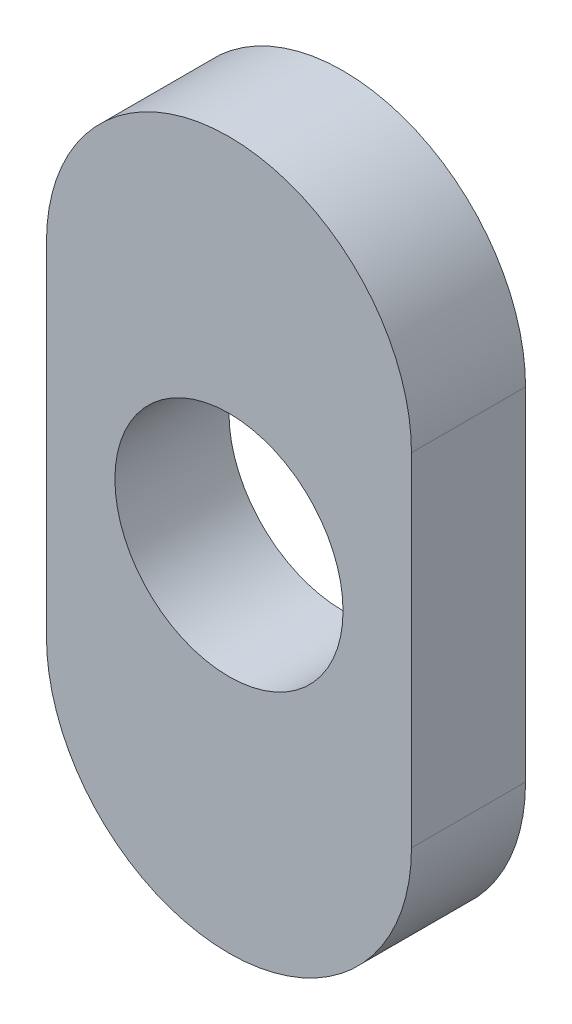
ISO-10303-21;
HEADER;
FILE_DESCRIPTION(('STEP AP214'),'2;1');
FILE_NAME('part.step','',(''),(''),'','','');
FILE_SCHEMA(('AUTOMOTIVE_DESIGN { 1 0 10303 214 1 1 1 1 }'));
ENDSEC;
DATA;
#1=APPLICATION_CONTEXT('core data for automotive mechanical design processes');
#2=APPLICATION_PROTOCOL_DEFINITION('international standard','automotive_design',2000,#1);
#3=PRODUCT_CONTEXT('',#1,'mechanical');
#4=PRODUCT('Part','Part','',(#3));
#5=PRODUCT_RELATED_PRODUCT_CATEGORY('part','',(#4));
#6=PRODUCT_DEFINITION_FORMATION('','',#4);
#7=PRODUCT_DEFINITION_CONTEXT('part definition',#1,'design');
#8=PRODUCT_DEFINITION('design','',#6,#7);
#9=PRODUCT_DEFINITION_SHAPE('','',#8);
#10=(LENGTH_UNIT() NAMED_UNIT(*) SI_UNIT(.MILLI.,.METRE.));
#11=(NAMED_UNIT(*) PLANE_ANGLE_UNIT() SI_UNIT($,.RADIAN.));
#12=(NAMED_UNIT(*) SI_UNIT($,.STERADIAN.) SOLID_ANGLE_UNIT());
#13=UNCERTAINTY_MEASURE_WITH_UNIT(LENGTH_MEASURE(1.E-05),#10,'distance_accuracy_value','');
#14=(GEOMETRIC_REPRESENTATION_CONTEXT(3) GLOBAL_UNCERTAINTY_ASSIGNED_CONTEXT((#13)) GLOBAL_UNIT_ASSIGNED_CONTEXT((#10,
#11,#12)) REPRESENTATION_CONTEXT('',''));
#15=CARTESIAN_POINT('',(0.,0.,0.));
#16=DIRECTION('',(0.,0.,1.));
#17=DIRECTION('',(1.,0.,0.));
#18=AXIS2_PLACEMENT_3D('',#15,#16,#17);
#19=CARTESIAN_POINT('',(0.,-7.5,5.));
#20=DIRECTION('',(0.,0.,-1.));
#21=DIRECTION('',(-1.,0.,0.));
#22=AXIS2_PLACEMENT_3D('',#19,#20,#21);
#23=CYLINDRICAL_SURFACE('',#22,8.);
#24=CARTESIAN_POINT('',(0.,-7.5,0.));
#25=DIRECTION('',(0.,0.,1.));
#26=DIRECTION('',(1.,0.,0.));
#27=AXIS2_PLACEMENT_3D('',#24,#25,#26);
#28=CIRCLE('',#27,8.);
#29=CARTESIAN_POINT('',(-8.,-7.5,0.));
#30=VERTEX_POINT('',#29);
#31=CARTESIAN_POINT('',(8.,-7.5,0.));
#32=VERTEX_POINT('',#31);
#33=EDGE_CURVE('E109',#30,#32,#28,.T.);
#34=ORIENTED_EDGE('',*,*,#33,.T.);
#35=DIRECTION('',(0.,0.,-1.));
#36=VECTOR('',#35,1.);
#37=CARTESIAN_POINT('',(8.,-7.5,5.));
#38=LINE('',#37,#36);
#39=CARTESIAN_POINT('',(8.,-7.5,5.));
#40=VERTEX_POINT('',#39);
#41=EDGE_CURVE('E11',#40,#32,#38,.T.);
#42=ORIENTED_EDGE('',*,*,#41,.F.);
#43=CARTESIAN_POINT('',(0.,-7.5,5.));
#44=DIRECTION('',(0.,0.,1.));
#45=DIRECTION('',(1.,0.,0.));
#46=AXIS2_PLACEMENT_3D('',#43,#44,#45);
#47=CIRCLE('',#46,8.);
#48=CARTESIAN_POINT('',(-8.,-7.5,5.));
#49=VERTEX_POINT('',#48);
#50=EDGE_CURVE('E92',#49,#40,#47,.T.);
#51=ORIENTED_EDGE('',*,*,#50,.F.);
#52=DIRECTION('',(0.,0.,-1.));
#53=VECTOR('',#52,1.);
#54=CARTESIAN_POINT('',(-8.,-7.5,5.));
#55=LINE('',#54,#53);
#56=EDGE_CURVE('E105',#49,#30,#55,.T.);
#57=ORIENTED_EDGE('',*,*,#56,.T.);
#58=EDGE_LOOP('',(#34,#42,#51,#57));
#59=FACE_BOUND('',#58,.T.);
#60=ADVANCED_FACE('F39',(#59),#23,.T.);
#61=CARTESIAN_POINT('',(8.,-7.5,5.));
#62=DIRECTION('',(-1.,0.,0.));
#63=DIRECTION('',(0.,-1.,0.));
#64=AXIS2_PLACEMENT_3D('',#61,#62,#63);
#65=PLANE('',#64);
#66=DIRECTION('',(0.,1.,0.));
#67=VECTOR('',#66,1.);
#68=CARTESIAN_POINT('',(8.,-7.5,0.));
#69=LINE('',#68,#67);
#70=CARTESIAN_POINT('',(8.,7.5,0.));
#71=VERTEX_POINT('',#70);
#72=EDGE_CURVE('E97',#32,#71,#69,.T.);
#73=ORIENTED_EDGE('',*,*,#72,.T.);
#74=DIRECTION('',(0.,0.,-1.));
#75=VECTOR('',#74,1.);
#76=CARTESIAN_POINT('',(8.,7.5,5.));
#77=LINE('',#76,#75);
#78=CARTESIAN_POINT('',(8.,7.5,5.));
#79=VERTEX_POINT('',#78);
#80=EDGE_CURVE('E49',#79,#71,#77,.T.);
#81=ORIENTED_EDGE('',*,*,#80,.F.);
#82=DIRECTION('',(0.,1.,0.));
#83=VECTOR('',#82,1.);
#84=CARTESIAN_POINT('',(8.,-7.5,5.));
#85=LINE('',#84,#83);
#86=EDGE_CURVE('E87',#40,#79,#85,.T.);
#87=ORIENTED_EDGE('',*,*,#86,.F.);
#88=ORIENTED_EDGE('',*,*,#41,.T.);
#89=EDGE_LOOP('',(#73,#81,#87,#88));
#90=FACE_BOUND('',#89,.T.);
#91=ADVANCED_FACE('F96',(#90),#65,.F.);
#92=CARTESIAN_POINT('',(0.,7.5,5.));
#93=DIRECTION('',(0.,0.,-1.));
#94=DIRECTION('',(-1.,0.,0.));
#95=AXIS2_PLACEMENT_3D('',#92,#93,#94);
#96=CYLINDRICAL_SURFACE('',#95,8.);
#97=CARTESIAN_POINT('',(0.,7.5,0.));
#98=DIRECTION('',(0.,0.,1.));
#99=DIRECTION('',(1.,0.,0.));
#100=AXIS2_PLACEMENT_3D('',#97,#98,#99);
#101=CIRCLE('',#100,8.);
#102=CARTESIAN_POINT('',(-8.00000000000001,7.5,0.));
#103=VERTEX_POINT('',#102);
#104=EDGE_CURVE('E74',#71,#103,#101,.T.);
#105=ORIENTED_EDGE('',*,*,#104,.T.);
#106=DIRECTION('',(0.,0.,-1.));
#107=VECTOR('',#106,1.);
#108=CARTESIAN_POINT('',(-8.00000000000001,7.5,5.));
#109=LINE('',#108,#107);
#110=CARTESIAN_POINT('',(-8.00000000000001,7.5,5.));
#111=VERTEX_POINT('',#110);
#112=EDGE_CURVE('E99',#111,#103,#109,.T.);
#113=ORIENTED_EDGE('',*,*,#112,.F.);
#114=CARTESIAN_POINT('',(0.,7.5,5.));
#115=DIRECTION('',(0.,0.,1.));
#116=DIRECTION('',(1.,0.,0.));
#117=AXIS2_PLACEMENT_3D('',#114,#115,#116);
#118=CIRCLE('',#117,8.);
#119=EDGE_CURVE('E90',#79,#111,#118,.T.);
#120=ORIENTED_EDGE('',*,*,#119,.F.);
#121=ORIENTED_EDGE('',*,*,#80,.T.);
#122=EDGE_LOOP('',(#105,#113,#120,#121));
#123=FACE_BOUND('',#122,.T.);
#124=ADVANCED_FACE('F101',(#123),#96,.T.);
#125=CARTESIAN_POINT('',(-8.,-7.5,5.));
#126=DIRECTION('',(1.,0.,0.));
#127=DIRECTION('',(0.,1.,0.));
#128=AXIS2_PLACEMENT_3D('',#125,#126,#127);
#129=PLANE('',#128);
#130=DIRECTION('',(0.,-1.,0.));
#131=VECTOR('',#130,1.);
#132=CARTESIAN_POINT('',(-8.,-7.5,0.));
#133=LINE('',#132,#131);
#134=EDGE_CURVE('E80',#103,#30,#133,.T.);
#135=ORIENTED_EDGE('',*,*,#134,.T.);
#136=ORIENTED_EDGE('',*,*,#56,.F.);
#137=DIRECTION('',(0.,-1.,0.));
#138=VECTOR('',#137,1.);
#139=CARTESIAN_POINT('',(-8.,-7.5,5.));
#140=LINE('',#139,#138);
#141=EDGE_CURVE('E57',#111,#49,#140,.T.);
#142=ORIENTED_EDGE('',*,*,#141,.F.);
#143=ORIENTED_EDGE('',*,*,#112,.T.);
#144=EDGE_LOOP('',(#135,#136,#142,#143));
#145=FACE_BOUND('',#144,.T.);
#146=ADVANCED_FACE('F122',(#145),#129,.F.);
#147=CARTESIAN_POINT('',(0.,-7.5,5.));
#148=DIRECTION('',(0.,0.,1.));
#149=DIRECTION('',(1.,0.,0.));
#150=AXIS2_PLACEMENT_3D('',#147,#148,#149);
#151=PLANE('',#150);
#152=CARTESIAN_POINT('',(0.,0.,5.));
#153=DIRECTION('',(0.,0.,1.));
#154=DIRECTION('',(1.,0.,0.));
#155=AXIS2_PLACEMENT_3D('',#152,#153,#154);
#156=CIRCLE('',#155,5.);
#157=CARTESIAN_POINT('',(5.,0.,5.));
#158=VERTEX_POINT('',#157);
#159=EDGE_CURVE('E129',#158,#158,#156,.T.);
#160=ORIENTED_EDGE('',*,*,#159,.F.);
#161=EDGE_LOOP('',(#160));
#162=FACE_BOUND('',#161,.T.);
#163=ORIENTED_EDGE('',*,*,#50,.T.);
#164=ORIENTED_EDGE('',*,*,#86,.T.);
#165=ORIENTED_EDGE('',*,*,#119,.T.);
#166=ORIENTED_EDGE('',*,*,#141,.T.);
#167=EDGE_LOOP('',(#163,#164,#165,#166));
#168=FACE_BOUND('',#167,.T.);
#169=ADVANCED_FACE('F88',(#162,#168),#151,.T.);
#170=CARTESIAN_POINT('',(0.,-7.5,0.));
#171=DIRECTION('',(0.,0.,1.));
#172=DIRECTION('',(1.,0.,0.));
#173=AXIS2_PLACEMENT_3D('',#170,#171,#172);
#174=PLANE('',#173);
#175=CARTESIAN_POINT('',(0.,0.,0.));
#176=DIRECTION('',(0.,0.,1.));
#177=DIRECTION('',(1.,0.,0.));
#178=AXIS2_PLACEMENT_3D('',#175,#176,#177);
#179=CIRCLE('',#178,5.);
#180=CARTESIAN_POINT('',(5.,0.,0.));
#181=VERTEX_POINT('',#180);
#182=EDGE_CURVE('E42',#181,#181,#179,.T.);
#183=ORIENTED_EDGE('',*,*,#182,.T.);
#184=EDGE_LOOP('',(#183));
#185=FACE_BOUND('',#184,.T.);
#186=ORIENTED_EDGE('',*,*,#33,.F.);
#187=ORIENTED_EDGE('',*,*,#134,.F.);
#188=ORIENTED_EDGE('',*,*,#104,.F.);
#189=ORIENTED_EDGE('',*,*,#72,.F.);
#190=EDGE_LOOP('',(#186,#187,#188,#189));
#191=FACE_BOUND('',#190,.T.);
#192=ADVANCED_FACE('F125',(#185,#191),#174,.F.);
#193=CARTESIAN_POINT('',(0.,0.,-5.));
#194=DIRECTION('',(0.,0.,1.));
#195=DIRECTION('',(1.,0.,0.));
#196=AXIS2_PLACEMENT_3D('',#193,#194,#195);
#197=CYLINDRICAL_SURFACE('',#196,5.);
#198=ORIENTED_EDGE('',*,*,#159,.T.);
#199=EDGE_LOOP('',(#198));
#200=FACE_BOUND('',#199,.T.);
#201=ORIENTED_EDGE('',*,*,#182,.F.);
#202=EDGE_LOOP('',(#201));
#203=FACE_BOUND('',#202,.T.);
#204=ADVANCED_FACE('F139',(#200,#203),#197,.F.);
#205=CLOSED_SHELL('',(#60,#91,#124,#146,#169,#192,#204));
#206=MANIFOLD_SOLID_BREP('B2',#205);
#207=ADVANCED_BREP_SHAPE_REPRESENTATION('',(#18,#206),#14);
#208=SHAPE_DEFINITION_REPRESENTATION(#9,#207);
ENDSEC;
END-ISO-10303-21;
